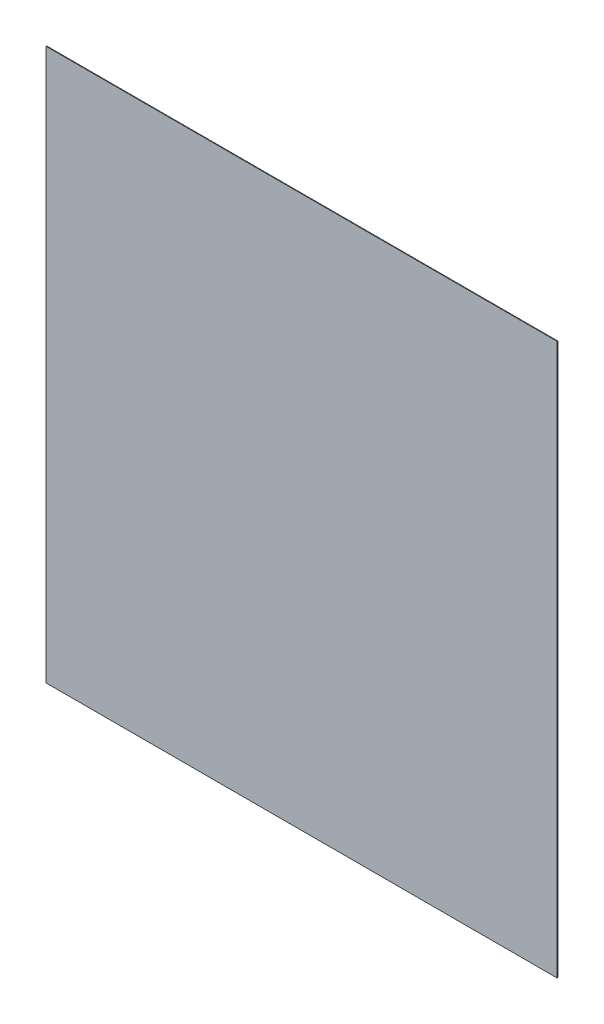
ISO-10303-21;
HEADER;
FILE_DESCRIPTION(('STEP AP214'),'2;1');
FILE_NAME('part.step','',(''),(''),'','','');
FILE_SCHEMA(('AUTOMOTIVE_DESIGN { 1 0 10303 214 1 1 1 1 }'));
ENDSEC;
DATA;
#1=APPLICATION_CONTEXT('core data for automotive mechanical design processes');
#2=APPLICATION_PROTOCOL_DEFINITION('international standard','automotive_design',2000,#1);
#3=PRODUCT_CONTEXT('',#1,'mechanical');
#4=PRODUCT('Part','Part','',(#3));
#5=PRODUCT_RELATED_PRODUCT_CATEGORY('part','',(#4));
#6=PRODUCT_DEFINITION_FORMATION('','',#4);
#7=PRODUCT_DEFINITION_CONTEXT('part definition',#1,'design');
#8=PRODUCT_DEFINITION('design','',#6,#7);
#9=PRODUCT_DEFINITION_SHAPE('','',#8);
#10=(LENGTH_UNIT() NAMED_UNIT(*) SI_UNIT(.MILLI.,.METRE.));
#11=(NAMED_UNIT(*) PLANE_ANGLE_UNIT() SI_UNIT($,.RADIAN.));
#12=(NAMED_UNIT(*) SI_UNIT($,.STERADIAN.) SOLID_ANGLE_UNIT());
#13=UNCERTAINTY_MEASURE_WITH_UNIT(LENGTH_MEASURE(1.E-05),#10,'distance_accuracy_value','');
#14=(GEOMETRIC_REPRESENTATION_CONTEXT(3) GLOBAL_UNCERTAINTY_ASSIGNED_CONTEXT((#13)) GLOBAL_UNIT_ASSIGNED_CONTEXT((#10,
#11,#12)) REPRESENTATION_CONTEXT('',''));
#15=CARTESIAN_POINT('',(0.,0.,0.));
#16=DIRECTION('',(0.,0.,1.));
#17=DIRECTION('',(1.,0.,0.));
#18=AXIS2_PLACEMENT_3D('',#15,#16,#17);
#19=CARTESIAN_POINT('',(0.,0.,15.));
#20=DIRECTION('',(1.,0.,0.));
#21=DIRECTION('',(0.,0.,-1.));
#22=AXIS2_PLACEMENT_3D('',#19,#20,#21);
#23=PLANE('',#22);
#24=DIRECTION('',(0.,-1.,0.));
#25=VECTOR('',#24,1.);
#26=CARTESIAN_POINT('',(0.,0.,0.));
#27=LINE('',#26,#25);
#28=CARTESIAN_POINT('',(0.,12950.,0.));
#29=VERTEX_POINT('',#28);
#30=CARTESIAN_POINT('',(0.,0.,0.));
#31=VERTEX_POINT('',#30);
#32=EDGE_CURVE('E104',#29,#31,#27,.T.);
#33=ORIENTED_EDGE('',*,*,#32,.T.);
#34=DIRECTION('',(0.,0.,-1.));
#35=VECTOR('',#34,1.);
#36=CARTESIAN_POINT('',(0.,0.,15.));
#37=LINE('',#36,#35);
#38=CARTESIAN_POINT('',(0.,0.,15.));
#39=VERTEX_POINT('',#38);
#40=EDGE_CURVE('E11',#39,#31,#37,.T.);
#41=ORIENTED_EDGE('',*,*,#40,.F.);
#42=DIRECTION('',(0.,-1.,0.));
#43=VECTOR('',#42,1.);
#44=CARTESIAN_POINT('',(0.,0.,15.));
#45=LINE('',#44,#43);
#46=CARTESIAN_POINT('',(0.,12950.,15.));
#47=VERTEX_POINT('',#46);
#48=EDGE_CURVE('E92',#47,#39,#45,.T.);
#49=ORIENTED_EDGE('',*,*,#48,.F.);
#50=DIRECTION('',(0.,0.,-1.));
#51=VECTOR('',#50,1.);
#52=CARTESIAN_POINT('',(0.,12950.,15.));
#53=LINE('',#52,#51);
#54=EDGE_CURVE('E100',#47,#29,#53,.T.);
#55=ORIENTED_EDGE('',*,*,#54,.T.);
#56=EDGE_LOOP('',(#33,#41,#49,#55));
#57=FACE_BOUND('',#56,.T.);
#58=ADVANCED_FACE('F41',(#57),#23,.F.);
#59=CARTESIAN_POINT('',(0.,0.,15.));
#60=DIRECTION('',(0.,1.,0.));
#61=DIRECTION('',(0.,0.,1.));
#62=AXIS2_PLACEMENT_3D('',#59,#60,#61);
#63=PLANE('',#62);
#64=DIRECTION('',(1.,0.,0.));
#65=VECTOR('',#64,1.);
#66=CARTESIAN_POINT('',(0.,0.,0.));
#67=LINE('',#66,#65);
#68=CARTESIAN_POINT('',(12000.,0.,0.));
#69=VERTEX_POINT('',#68);
#70=EDGE_CURVE('E96',#31,#69,#67,.T.);
#71=ORIENTED_EDGE('',*,*,#70,.T.);
#72=DIRECTION('',(0.,0.,-1.));
#73=VECTOR('',#72,1.);
#74=CARTESIAN_POINT('',(12000.,0.,15.));
#75=LINE('',#74,#73);
#76=CARTESIAN_POINT('',(12000.,0.,15.));
#77=VERTEX_POINT('',#76);
#78=EDGE_CURVE('E49',#77,#69,#75,.T.);
#79=ORIENTED_EDGE('',*,*,#78,.F.);
#80=DIRECTION('',(1.,0.,0.));
#81=VECTOR('',#80,1.);
#82=CARTESIAN_POINT('',(0.,0.,15.));
#83=LINE('',#82,#81);
#84=EDGE_CURVE('E87',#39,#77,#83,.T.);
#85=ORIENTED_EDGE('',*,*,#84,.F.);
#86=ORIENTED_EDGE('',*,*,#40,.T.);
#87=EDGE_LOOP('',(#71,#79,#85,#86));
#88=FACE_BOUND('',#87,.T.);
#89=ADVANCED_FACE('F95',(#88),#63,.F.);
#90=CARTESIAN_POINT('',(12000.,0.,15.));
#91=DIRECTION('',(-1.,0.,0.));
#92=DIRECTION('',(0.,0.,1.));
#93=AXIS2_PLACEMENT_3D('',#90,#91,#92);
#94=PLANE('',#93);
#95=DIRECTION('',(0.,1.,0.));
#96=VECTOR('',#95,1.);
#97=CARTESIAN_POINT('',(12000.,0.,0.));
#98=LINE('',#97,#96);
#99=CARTESIAN_POINT('',(12000.,12950.,0.));
#100=VERTEX_POINT('',#99);
#101=EDGE_CURVE('E74',#69,#100,#98,.T.);
#102=ORIENTED_EDGE('',*,*,#101,.T.);
#103=DIRECTION('',(0.,0.,-1.));
#104=VECTOR('',#103,1.);
#105=CARTESIAN_POINT('',(12000.,12950.,15.));
#106=LINE('',#105,#104);
#107=CARTESIAN_POINT('',(12000.,12950.,15.));
#108=VERTEX_POINT('',#107);
#109=EDGE_CURVE('E97',#108,#100,#106,.T.);
#110=ORIENTED_EDGE('',*,*,#109,.F.);
#111=DIRECTION('',(0.,1.,0.));
#112=VECTOR('',#111,1.);
#113=CARTESIAN_POINT('',(12000.,0.,15.));
#114=LINE('',#113,#112);
#115=EDGE_CURVE('E90',#77,#108,#114,.T.);
#116=ORIENTED_EDGE('',*,*,#115,.F.);
#117=ORIENTED_EDGE('',*,*,#78,.T.);
#118=EDGE_LOOP('',(#102,#110,#116,#117));
#119=FACE_BOUND('',#118,.T.);
#120=ADVANCED_FACE('F98',(#119),#94,.F.);
#121=CARTESIAN_POINT('',(0.,12950.,15.));
#122=DIRECTION('',(0.,-1.,0.));
#123=DIRECTION('',(0.,0.,-1.));
#124=AXIS2_PLACEMENT_3D('',#121,#122,#123);
#125=PLANE('',#124);
#126=DIRECTION('',(-1.,0.,0.));
#127=VECTOR('',#126,1.);
#128=CARTESIAN_POINT('',(0.,12950.,0.));
#129=LINE('',#128,#127);
#130=EDGE_CURVE('E80',#100,#29,#129,.T.);
#131=ORIENTED_EDGE('',*,*,#130,.T.);
#132=ORIENTED_EDGE('',*,*,#54,.F.);
#133=DIRECTION('',(-1.,0.,0.));
#134=VECTOR('',#133,1.);
#135=CARTESIAN_POINT('',(0.,12950.,15.));
#136=LINE('',#135,#134);
#137=EDGE_CURVE('E57',#108,#47,#136,.T.);
#138=ORIENTED_EDGE('',*,*,#137,.F.);
#139=ORIENTED_EDGE('',*,*,#109,.T.);
#140=EDGE_LOOP('',(#131,#132,#138,#139));
#141=FACE_BOUND('',#140,.T.);
#142=ADVANCED_FACE('F111',(#141),#125,.F.);
#143=CARTESIAN_POINT('',(0.,12950.,15.));
#144=DIRECTION('',(0.,0.,-1.));
#145=DIRECTION('',(-1.,0.,0.));
#146=AXIS2_PLACEMENT_3D('',#143,#144,#145);
#147=PLANE('',#146);
#148=ORIENTED_EDGE('',*,*,#48,.T.);
#149=ORIENTED_EDGE('',*,*,#84,.T.);
#150=ORIENTED_EDGE('',*,*,#115,.T.);
#151=ORIENTED_EDGE('',*,*,#137,.T.);
#152=EDGE_LOOP('',(#148,#149,#150,#151));
#153=FACE_BOUND('',#152,.T.);
#154=ADVANCED_FACE('F88',(#153),#147,.F.);
#155=CARTESIAN_POINT('',(0.,12950.,0.));
#156=DIRECTION('',(0.,0.,-1.));
#157=DIRECTION('',(-1.,0.,0.));
#158=AXIS2_PLACEMENT_3D('',#155,#156,#157);
#159=PLANE('',#158);
#160=ORIENTED_EDGE('',*,*,#32,.F.);
#161=ORIENTED_EDGE('',*,*,#130,.F.);
#162=ORIENTED_EDGE('',*,*,#101,.F.);
#163=ORIENTED_EDGE('',*,*,#70,.F.);
#164=EDGE_LOOP('',(#160,#161,#162,#163));
#165=FACE_BOUND('',#164,.T.);
#166=ADVANCED_FACE('F114',(#165),#159,.T.);
#167=CLOSED_SHELL('',(#58,#89,#120,#142,#154,#166));
#168=MANIFOLD_SOLID_BREP('B2',#167);
#169=ADVANCED_BREP_SHAPE_REPRESENTATION('',(#18,#168),#14);
#170=SHAPE_DEFINITION_REPRESENTATION(#9,#169);
ENDSEC;
END-ISO-10303-21;
